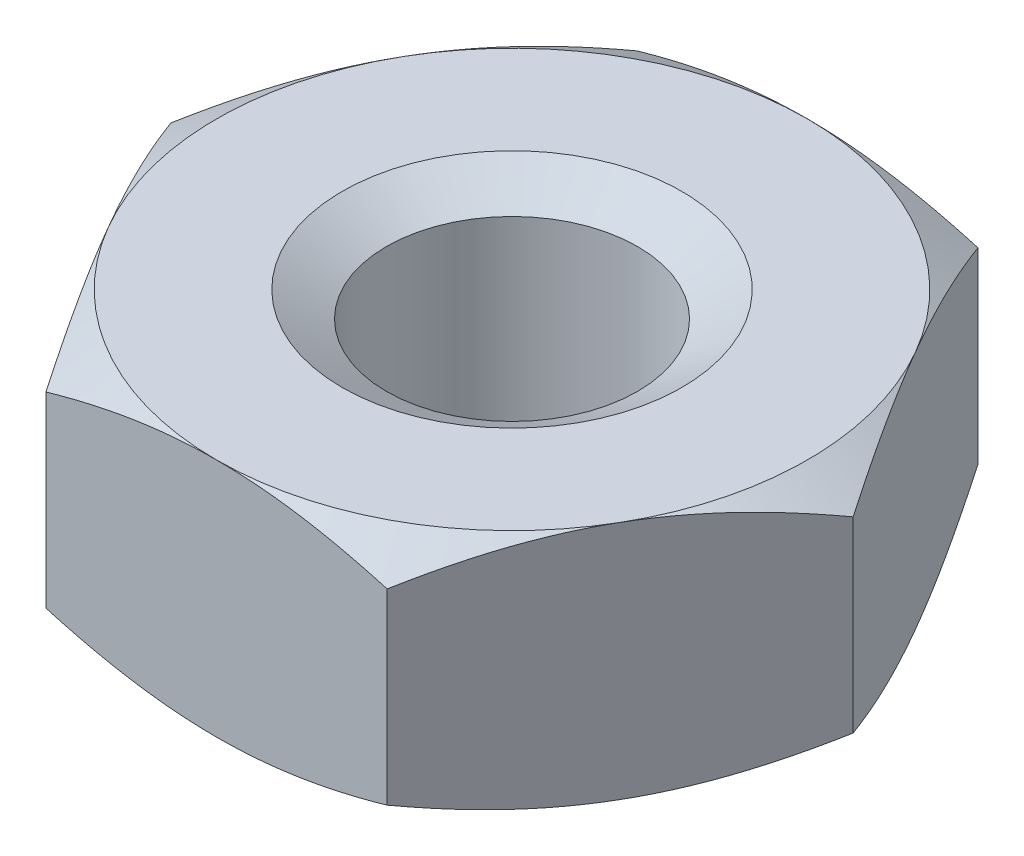
ISO-10303-21;
HEADER;
FILE_DESCRIPTION(('STEP AP214'),'2;1');
FILE_NAME('part.step','',(''),(''),'','','');
FILE_SCHEMA(('AUTOMOTIVE_DESIGN { 1 0 10303 214 1 1 1 1 }'));
ENDSEC;
DATA;
#1=APPLICATION_CONTEXT('core data for automotive mechanical design processes');
#2=APPLICATION_PROTOCOL_DEFINITION('international standard','automotive_design',2000,#1);
#3=PRODUCT_CONTEXT('',#1,'mechanical');
#4=PRODUCT('Part','Part','',(#3));
#5=PRODUCT_RELATED_PRODUCT_CATEGORY('part','',(#4));
#6=PRODUCT_DEFINITION_FORMATION('','',#4);
#7=PRODUCT_DEFINITION_CONTEXT('part definition',#1,'design');
#8=PRODUCT_DEFINITION('design','',#6,#7);
#9=PRODUCT_DEFINITION_SHAPE('','',#8);
#10=(LENGTH_UNIT() NAMED_UNIT(*) SI_UNIT(.MILLI.,.METRE.));
#11=(NAMED_UNIT(*) PLANE_ANGLE_UNIT() SI_UNIT($,.RADIAN.));
#12=(NAMED_UNIT(*) SI_UNIT($,.STERADIAN.) SOLID_ANGLE_UNIT());
#13=UNCERTAINTY_MEASURE_WITH_UNIT(LENGTH_MEASURE(1.E-05),#10,'distance_accuracy_value','');
#14=(GEOMETRIC_REPRESENTATION_CONTEXT(3) GLOBAL_UNCERTAINTY_ASSIGNED_CONTEXT((#13)) GLOBAL_UNIT_ASSIGNED_CONTEXT((#10,
#11,#12)) REPRESENTATION_CONTEXT('',''));
#15=CARTESIAN_POINT('',(0.,0.,0.));
#16=DIRECTION('',(0.,0.,1.));
#17=DIRECTION('',(1.,0.,0.));
#18=AXIS2_PLACEMENT_3D('',#15,#16,#17);
#19=CARTESIAN_POINT('',(1.84752086140681,-0.65,0.));
#20=DIRECTION('',(0.,1.,0.));
#21=DIRECTION('',(0.,0.,1.));
#22=AXIS2_PLACEMENT_3D('',#19,#20,#21);
#23=PLANE('',#22);
#24=CARTESIAN_POINT('',(0.,-0.650000000000017,0.));
#25=DIRECTION('',(0.,1.,0.));
#26=DIRECTION('',(0.,0.,1.));
#27=AXIS2_PLACEMENT_3D('',#24,#25,#26);
#28=CIRCLE('',#27,1.6);
#29=CARTESIAN_POINT('',(0.,-0.650000000000033,1.59999999999999));
#30=VERTEX_POINT('',#29);
#31=CARTESIAN_POINT('',(1.38564064605509,-0.650000000000025,0.800000000000011));
#32=VERTEX_POINT('',#31);
#33=EDGE_CURVE('E132',#30,#32,#28,.T.);
#34=ORIENTED_EDGE('',*,*,#33,.F.);
#35=CARTESIAN_POINT('',(0.,-0.65,0.));
#36=DIRECTION('',(0.,1.,0.));
#37=DIRECTION('',(0.,0.,1.));
#38=AXIS2_PLACEMENT_3D('',#35,#36,#37);
#39=CIRCLE('',#38,1.60000000000003);
#40=CARTESIAN_POINT('',(-1.38564064605509,-0.650000000000025,0.800000000000012));
#41=VERTEX_POINT('',#40);
#42=EDGE_CURVE('E11',#30,#41,#39,.F.);
#43=ORIENTED_EDGE('',*,*,#42,.T.);
#44=CARTESIAN_POINT('',(-1.38564064605511,-0.650000000000008,-0.799999999999981));
#45=VERTEX_POINT('',#44);
#46=EDGE_CURVE('E39',#41,#45,#39,.F.);
#47=ORIENTED_EDGE('',*,*,#46,.T.);
#48=CARTESIAN_POINT('',(0.,-0.65,-1.6));
#49=VERTEX_POINT('',#48);
#50=EDGE_CURVE('E346',#45,#49,#39,.F.);
#51=ORIENTED_EDGE('',*,*,#50,.T.);
#52=CARTESIAN_POINT('',(1.38564064605511,-0.650000000000008,-0.799999999999992));
#53=VERTEX_POINT('',#52);
#54=EDGE_CURVE('E142',#49,#53,#39,.F.);
#55=ORIENTED_EDGE('',*,*,#54,.T.);
#56=EDGE_CURVE('E41',#53,#32,#39,.F.);
#57=ORIENTED_EDGE('',*,*,#56,.T.);
#58=EDGE_LOOP('',(#34,#43,#47,#51,#55,#57));
#59=FACE_BOUND('',#58,.T.);
#60=CARTESIAN_POINT('',(0.,-0.65,0.));
#61=DIRECTION('',(0.,1.,0.));
#62=DIRECTION('',(0.,0.,1.));
#63=AXIS2_PLACEMENT_3D('',#60,#61,#62);
#64=CIRCLE('',#63,0.92);
#65=CARTESIAN_POINT('',(0.,-0.65,0.92));
#66=VERTEX_POINT('',#65);
#67=EDGE_CURVE('E255',#66,#66,#64,.T.);
#68=ORIENTED_EDGE('',*,*,#67,.T.);
#69=EDGE_LOOP('',(#68));
#70=FACE_BOUND('',#69,.T.);
#71=ADVANCED_FACE('F29',(#59,#70),#23,.F.);
#72=CARTESIAN_POINT('',(0.,-0.65,0.));
#73=DIRECTION('',(0.,1.,0.));
#74=DIRECTION('',(0.,0.,1.));
#75=AXIS2_PLACEMENT_3D('',#72,#73,#74);
#76=CYLINDRICAL_SURFACE('',#75,0.68);
#77=CARTESIAN_POINT('',(0.,0.511435935394491,0.));
#78=DIRECTION('',(0.,1.,0.));
#79=DIRECTION('',(0.,0.,1.));
#80=AXIS2_PLACEMENT_3D('',#77,#78,#79);
#81=CIRCLE('',#80,0.68);
#82=CARTESIAN_POINT('',(0.,0.511435935394491,0.68));
#83=VERTEX_POINT('',#82);
#84=EDGE_CURVE('E137',#83,#83,#81,.T.);
#85=ORIENTED_EDGE('',*,*,#84,.T.);
#86=EDGE_LOOP('',(#85));
#87=FACE_BOUND('',#86,.T.);
#88=CARTESIAN_POINT('',(0.,-0.511435935394491,0.));
#89=DIRECTION('',(0.,-1.,0.));
#90=DIRECTION('',(0.,0.,-1.));
#91=AXIS2_PLACEMENT_3D('',#88,#89,#90);
#92=CIRCLE('',#91,0.68);
#93=CARTESIAN_POINT('',(0.,-0.511435935394491,-0.68));
#94=VERTEX_POINT('',#93);
#95=EDGE_CURVE('E34',#94,#94,#92,.F.);
#96=ORIENTED_EDGE('',*,*,#95,.F.);
#97=EDGE_LOOP('',(#96));
#98=FACE_BOUND('',#97,.T.);
#99=ADVANCED_FACE('F169',(#87,#98),#76,.F.);
#100=CARTESIAN_POINT('',(0.923760430703417,0.65,1.59999999999999));
#101=DIRECTION('',(-0.866025403784439,0.,-0.499999999999999));
#102=DIRECTION('',(-0.499999999999999,0.,0.866025403784439));
#103=AXIS2_PLACEMENT_3D('',#100,#101,#102);
#104=PLANE('',#103);
#105=DIRECTION('',(0.,-1.,0.));
#106=VECTOR('',#105,1.);
#107=CARTESIAN_POINT('',(0.923760430703417,0.65,1.59999999999999));
#108=LINE('',#107,#106);
#109=CARTESIAN_POINT('',(0.923760430703417,0.507093764036709,1.59999999999999));
#110=VERTEX_POINT('',#109);
#111=CARTESIAN_POINT('',(0.923760430703417,-0.50709376403677,1.59999999999999));
#112=VERTEX_POINT('',#111);
#113=EDGE_CURVE('E147',#110,#112,#108,.T.);
#114=ORIENTED_EDGE('',*,*,#113,.T.);
#115=CARTESIAN_POINT('',(0.923644960649579,-0.507027091120494,1.60019999999999));
#116=CARTESIAN_POINT('',(0.964240585876116,-0.530476130648984,1.5298863145426));
#117=CARTESIAN_POINT('',(1.00518662765287,-0.551802641144221,1.45896568981643));
#118=CARTESIAN_POINT('',(1.08778782336024,-0.589029344135892,1.31589622208531));
#119=CARTESIAN_POINT('',(1.12944444565325,-0.604916365353103,1.24374483580212));
#120=CARTESIAN_POINT('',(1.21224140206854,-0.629648285435275,1.10033630057877));
#121=CARTESIAN_POINT('',(1.25336899245117,-0.638657763598411,1.02910122444318));
#122=CARTESIAN_POINT('',(1.33581782019458,-0.649415728756022,0.886295665767092));
#123=CARTESIAN_POINT('',(1.37713875761732,-0.651173121604833,0.814725702734531));
#124=CARTESIAN_POINT('',(1.45435771579557,-0.647528826941385,0.680978543862264));
#125=CARTESIAN_POINT('',(1.49026726082089,-0.643021940912404,0.618781387401727));
#126=CARTESIAN_POINT('',(1.5618523860239,-0.628734123806207,0.494792313483931));
#127=CARTESIAN_POINT('',(1.59752771836342,-0.618948305903803,0.433000825294993));
#128=CARTESIAN_POINT('',(1.66926059311825,-0.594483088670522,0.30875584164664));
#129=CARTESIAN_POINT('',(1.70530905059904,-0.579699920077157,0.24631808175543));
#130=CARTESIAN_POINT('',(1.77686812557048,-0.546147392216728,0.122374128162261));
#131=CARTESIAN_POINT('',(1.81237966076083,-0.527385923256054,0.0608663449578012));
#132=CARTESIAN_POINT('',(1.84763633146064,-0.507027091120478,-0.000199999999993177));
#133=B_SPLINE_CURVE_WITH_KNOTS('',3,(#115,#116,#117,#118,#119,#120,#121,#122,#123,#124,#125,
#126,#127,#128,#129,#130,#131,#132),.UNSPECIFIED.,.F.,.F.,(4,2,2,2,2,2,2,2,4),(0.,
0.253628622662479,0.507867113505241,0.75581244725919,1.00345320332839,1.21912891721901,
1.4350046304192,1.65567058644226,1.87590291418783),.UNSPECIFIED.);
#134=EDGE_CURVE('E53',#112,#32,#133,.T.);
#135=ORIENTED_EDGE('',*,*,#134,.T.);
#136=CARTESIAN_POINT('',(1.84752086140681,-0.507093764036754,0.));
#137=VERTEX_POINT('',#136);
#138=EDGE_CURVE('E121',#32,#137,#133,.T.);
#139=ORIENTED_EDGE('',*,*,#138,.T.);
#140=DIRECTION('',(0.,-1.,0.));
#141=VECTOR('',#140,1.);
#142=CARTESIAN_POINT('',(1.84752086140681,0.65,0.));
#143=LINE('',#142,#141);
#144=CARTESIAN_POINT('',(1.84752086140681,0.507093764036721,0.));
#145=VERTEX_POINT('',#144);
#146=EDGE_CURVE('E241',#145,#137,#143,.T.);
#147=ORIENTED_EDGE('',*,*,#146,.F.);
#148=CARTESIAN_POINT('',(1.84763633146064,0.507027091120445,-0.000199999999993179));
#149=CARTESIAN_POINT('',(1.80704070623411,0.530476130648936,0.070113685457395));
#150=CARTESIAN_POINT('',(1.76609466445735,0.551802641144175,0.141034310183567));
#151=CARTESIAN_POINT('',(1.68349346874998,0.589029344135848,0.284103777914686));
#152=CARTESIAN_POINT('',(1.64183684645697,0.604916365353061,0.356255164197875));
#153=CARTESIAN_POINT('',(1.55903989004168,0.629648285435234,0.499663699421233));
#154=CARTESIAN_POINT('',(1.51791229965905,0.638657763598371,0.570898775556817));
#155=CARTESIAN_POINT('',(1.43546347191564,0.649415728755983,0.713704334232908));
#156=CARTESIAN_POINT('',(1.3941425344929,0.651173121604794,0.78527429726547));
#157=CARTESIAN_POINT('',(1.31692357631465,0.647528826941346,0.919021456137737));
#158=CARTESIAN_POINT('',(1.28101403128933,0.643021940912366,0.981218612598273));
#159=CARTESIAN_POINT('',(1.20942890608632,0.628734123806167,1.10520768651607));
#160=CARTESIAN_POINT('',(1.1737535737468,0.618948305903763,1.16699917470501));
#161=CARTESIAN_POINT('',(1.10202069899197,0.594483088670481,1.29124415835336));
#162=CARTESIAN_POINT('',(1.06597224151118,0.579699920077116,1.35368191824457));
#163=CARTESIAN_POINT('',(0.994413166539739,0.546147392216685,1.47762587183774));
#164=CARTESIAN_POINT('',(0.958901631349387,0.52738592325601,1.5391336550422));
#165=CARTESIAN_POINT('',(0.923644960649579,0.507027091120433,1.60019999999999));
#166=B_SPLINE_CURVE_WITH_KNOTS('',3,(#148,#149,#150,#151,#152,#153,#154,#155,#156,#157,#158,
#159,#160,#161,#162,#163,#164,#165),.UNSPECIFIED.,.F.,.F.,(4,2,2,2,2,2,2,2,4),(0.,
0.253628622662481,0.507867113505245,0.755812447259196,1.0034532033284,1.21912891721901,
1.4350046304192,1.65567058644227,1.87590291418783),.UNSPECIFIED.);
#167=CARTESIAN_POINT('',(1.38564064605511,0.649999999999975,0.800000000000022));
#168=VERTEX_POINT('',#167);
#169=EDGE_CURVE('E304',#145,#168,#166,.T.);
#170=ORIENTED_EDGE('',*,*,#169,.T.);
#171=EDGE_CURVE('E299',#168,#110,#166,.T.);
#172=ORIENTED_EDGE('',*,*,#171,.T.);
#173=EDGE_LOOP('',(#114,#135,#139,#147,#170,#172));
#174=FACE_BOUND('',#173,.T.);
#175=ADVANCED_FACE('F31',(#174),#104,.F.);
#176=CARTESIAN_POINT('',(1.84752086140681,0.65,0.));
#177=DIRECTION('',(-0.866025403784436,0.,0.500000000000005));
#178=DIRECTION('',(0.500000000000005,0.,0.866025403784436));
#179=AXIS2_PLACEMENT_3D('',#176,#177,#178);
#180=PLANE('',#179);
#181=ORIENTED_EDGE('',*,*,#146,.T.);
#182=CARTESIAN_POINT('',(1.84763633146064,-0.507027091120477,0.000200000000006787));
#183=CARTESIAN_POINT('',(1.80704070623411,-0.530476130648968,-0.0701136854573808));
#184=CARTESIAN_POINT('',(1.76609466445735,-0.551802641144206,-0.141034310183552));
#185=CARTESIAN_POINT('',(1.68349346874998,-0.589029344135879,-0.284103777914669));
#186=CARTESIAN_POINT('',(1.64183684645697,-0.604916365353092,-0.356255164197858));
#187=CARTESIAN_POINT('',(1.55903989004168,-0.629648285435266,-0.499663699421214));
#188=CARTESIAN_POINT('',(1.51791229965905,-0.638657763598402,-0.570898775556797));
#189=CARTESIAN_POINT('',(1.43546347191564,-0.649415728756015,-0.713704334232886));
#190=CARTESIAN_POINT('',(1.3941425344929,-0.651173121604828,-0.785274297265447));
#191=CARTESIAN_POINT('',(1.31692357631464,-0.647528826941381,-0.919021456137716));
#192=CARTESIAN_POINT('',(1.28101403128932,-0.643021940912401,-0.981218612598256));
#193=CARTESIAN_POINT('',(1.2094289060863,-0.628734123806204,-1.10520768651606));
#194=CARTESIAN_POINT('',(1.17375357374679,-0.6189483059038,-1.166999174705));
#195=CARTESIAN_POINT('',(1.10202069899195,-0.594483088670518,-1.29124415835336));
#196=CARTESIAN_POINT('',(1.06597224151116,-0.579699920077152,-1.35368191824457));
#197=CARTESIAN_POINT('',(0.994413166539713,-0.546147392216721,-1.47762587183774));
#198=CARTESIAN_POINT('',(0.958901631349359,-0.527385923256046,-1.53913365504221));
#199=CARTESIAN_POINT('',(0.923644960649547,-0.507027091120468,-1.6002));
#200=B_SPLINE_CURVE_WITH_KNOTS('',3,(#182,#183,#184,#185,#186,#187,#188,#189,#190,#191,#192,
#193,#194,#195,#196,#197,#198,#199),.UNSPECIFIED.,.F.,.F.,(4,2,2,2,2,2,2,2,4),(0.,
0.253628622662479,0.507867113505241,0.75581244725919,1.00345320332839,1.21912891721902,
1.43500463041922,1.65567058644229,1.87590291418787),.UNSPECIFIED.);
#201=EDGE_CURVE('E126',#137,#53,#200,.T.);
#202=ORIENTED_EDGE('',*,*,#201,.T.);
#203=CARTESIAN_POINT('',(0.923760430703385,-0.507093764036744,-1.6));
#204=VERTEX_POINT('',#203);
#205=EDGE_CURVE('E157',#53,#204,#200,.T.);
#206=ORIENTED_EDGE('',*,*,#205,.T.);
#207=DIRECTION('',(0.,-1.,0.));
#208=VECTOR('',#207,1.);
#209=CARTESIAN_POINT('',(0.923760430703385,0.65,-1.6));
#210=LINE('',#209,#208);
#211=CARTESIAN_POINT('',(0.923760430703385,0.507093764036739,-1.6));
#212=VERTEX_POINT('',#211);
#213=EDGE_CURVE('E238',#212,#204,#210,.T.);
#214=ORIENTED_EDGE('',*,*,#213,.F.);
#215=CARTESIAN_POINT('',(0.923644960649548,0.507027091120463,-1.6002));
#216=CARTESIAN_POINT('',(0.964240585876086,0.530476130648954,-1.52988631454262));
#217=CARTESIAN_POINT('',(1.00518662765284,0.551802641144193,-1.45896568981644));
#218=CARTESIAN_POINT('',(1.08778782336022,0.589029344135867,-1.31589622208533));
#219=CARTESIAN_POINT('',(1.12944444565322,0.60491636535308,-1.24374483580214));
#220=CARTESIAN_POINT('',(1.21224140206852,0.629648285435254,-1.10033630057878));
#221=CARTESIAN_POINT('',(1.25336899245114,0.638657763598391,-1.0291012244432));
#222=CARTESIAN_POINT('',(1.33581782019456,0.649415728756003,-0.886295665767107));
#223=CARTESIAN_POINT('',(1.3771387576173,0.651173121604815,-0.814725702734546));
#224=CARTESIAN_POINT('',(1.45435771579555,0.647528826941367,-0.680978543862277));
#225=CARTESIAN_POINT('',(1.49026726082087,0.643021940912387,-0.618781387401737));
#226=CARTESIAN_POINT('',(1.56185238602389,0.628734123806188,-0.494792313483937));
#227=CARTESIAN_POINT('',(1.5975277183634,0.618948305903783,-0.433000825294996));
#228=CARTESIAN_POINT('',(1.66926059311824,0.5944830886705,-0.308755841646639));
#229=CARTESIAN_POINT('',(1.70530905059903,0.579699920077133,-0.246318081755426));
#230=CARTESIAN_POINT('',(1.77686812557048,0.5461473922167,-0.122374128162252));
#231=CARTESIAN_POINT('',(1.81237966076083,0.527385923256024,-0.0608663449577898));
#232=CARTESIAN_POINT('',(1.84763633146064,0.507027091120445,0.000200000000006741));
#233=B_SPLINE_CURVE_WITH_KNOTS('',3,(#215,#216,#217,#218,#219,#220,#221,#222,#223,#224,#225,
#226,#227,#228,#229,#230,#231,#232),.UNSPECIFIED.,.F.,.F.,(4,2,2,2,2,2,2,2,4),(0.,
0.253628622662481,0.507867113505244,0.755812447259194,1.0034532033284,1.21912891721902,
1.43500463041922,1.6556705864423,1.87590291418787),.UNSPECIFIED.);
#234=CARTESIAN_POINT('',(1.38564064605511,0.649999999999991,-0.799999999999995));
#235=VERTEX_POINT('',#234);
#236=EDGE_CURVE('E314',#212,#235,#233,.T.);
#237=ORIENTED_EDGE('',*,*,#236,.T.);
#238=EDGE_CURVE('E223',#235,#145,#233,.T.);
#239=ORIENTED_EDGE('',*,*,#238,.T.);
#240=EDGE_LOOP('',(#181,#202,#206,#214,#237,#239));
#241=FACE_BOUND('',#240,.T.);
#242=ADVANCED_FACE('F208',(#241),#180,.F.);
#243=CARTESIAN_POINT('',(0.923760430703385,0.65,-1.6));
#244=DIRECTION('',(0.,0.,1.));
#245=DIRECTION('',(1.,0.,0.));
#246=AXIS2_PLACEMENT_3D('',#243,#244,#245);
#247=PLANE('',#246);
#248=ORIENTED_EDGE('',*,*,#213,.T.);
#249=CARTESIAN_POINT('',(-2.5209846471538,0.150126997097003,-1.6));
#250=CARTESIAN_POINT('',(-2.45076148068393,0.115904931717625,-1.6));
#251=CARTESIAN_POINT('',(-2.38038131225264,0.081999718330343,-1.6));
#252=CARTESIAN_POINT('',(-2.23922362863108,0.0150004327425696,-1.6));
#253=CARTESIAN_POINT('',(-2.16844605632522,-0.0180935189937226,-1.6));
#254=CARTESIAN_POINT('',(-2.0260641790118,-0.0834509737892938,-1.6));
#255=CARTESIAN_POINT('',(-1.95445749211139,-0.11570930512278,-1.6));
#256=CARTESIAN_POINT('',(-1.81068831039181,-0.178957843825118,-1.6));
#257=CARTESIAN_POINT('',(-1.7385258408879,-0.209948108551772,-1.6));
#258=CARTESIAN_POINT('',(-1.59104276125482,-0.27136295948913,-1.6));
#259=CARTESIAN_POINT('',(-1.51569874994579,-0.301731646229661,-1.6));
#260=CARTESIAN_POINT('',(-1.36415873924484,-0.360259147099093,-1.6));
#261=CARTESIAN_POINT('',(-1.28796281408451,-0.388418152080569,-1.6));
#262=CARTESIAN_POINT('',(-1.13470603922019,-0.441825257862485,-1.6));
#263=CARTESIAN_POINT('',(-1.05764705228117,-0.467078652047236,-1.6));
#264=CARTESIAN_POINT('',(-0.90242428913327,-0.513887366477864,-1.6));
#265=CARTESIAN_POINT('',(-0.824260856491372,-0.535443810489637,-1.6));
#266=CARTESIAN_POINT('',(-0.667228536874516,-0.573732922571515,-1.6));
#267=CARTESIAN_POINT('',(-0.588366526526667,-0.590493282507139,-1.6));
#268=CARTESIAN_POINT('',(-0.429622055404563,-0.618273619251159,-1.6));
#269=CARTESIAN_POINT('',(-0.349739703219398,-0.629294201781119,-1.6));
#270=CARTESIAN_POINT('',(-0.190409371418089,-0.644570738337796,-1.6));
#271=CARTESIAN_POINT('',(-0.110970273306694,-0.648916704735154,-1.6));
#272=CARTESIAN_POINT('',(0.0479847198414701,-0.650725446740208,-1.6));
#273=CARTESIAN_POINT('',(0.127500615320099,-0.648188182505916,-1.6));
#274=CARTESIAN_POINT('',(0.315948267624273,-0.634233456236218,-1.6));
#275=CARTESIAN_POINT('',(0.424660647824706,-0.619827036410199,-1.6));
#276=CARTESIAN_POINT('',(0.640184372550368,-0.580568185670082,-1.6));
#277=CARTESIAN_POINT('',(0.746993876383825,-0.555706157984184,-1.6));
#278=CARTESIAN_POINT('',(0.960879709209229,-0.497630124804474,-1.6));
#279=CARTESIAN_POINT('',(1.06790639530111,-0.464238301106111,-1.6));
#280=CARTESIAN_POINT('',(1.27996601991254,-0.391812517385375,-1.6));
#281=CARTESIAN_POINT('',(1.38499941444163,-0.352779865868096,-1.6));
#282=CARTESIAN_POINT('',(1.56799469532871,-0.280792189051455,-1.6));
#283=CARTESIAN_POINT('',(1.64629502070004,-0.248685434535845,-1.6));
#284=CARTESIAN_POINT('',(1.80215714392472,-0.182721638624275,-1.6));
#285=CARTESIAN_POINT('',(1.87971890500665,-0.14886451061522,-1.6));
#286=CARTESIAN_POINT('',(2.11154275742073,-0.045256837842374,-1.6));
#287=CARTESIAN_POINT('',(2.26490000358049,0.0265123792197082,-1.6));
#288=CARTESIAN_POINT('',(2.57016984682327,0.173498218896941,-1.6));
#289=CARTESIAN_POINT('',(2.72208039110132,0.248719051804576,-1.6));
#290=CARTESIAN_POINT('',(3.0247737416671,0.401405516169311,-1.6));
#291=CARTESIAN_POINT('',(3.17555650255188,0.478871237396957,-1.6));
#292=CARTESIAN_POINT('',(3.46221292814765,0.628015105044151,-1.6));
#293=CARTESIAN_POINT('',(3.59815887438349,0.699554850107216,-1.6));
#294=CARTESIAN_POINT('',(3.86955633050092,0.843580617163559,-1.6));
#295=CARTESIAN_POINT('',(4.00500781663135,0.916066683867109,-1.6));
#296=CARTESIAN_POINT('',(4.27512524652783,1.06153370741179,-1.6));
#297=CARTESIAN_POINT('',(4.40979232852615,1.1345125538553,-1.6));
#298=CARTESIAN_POINT('',(4.67881425363029,1.28102238761861,-1.6));
#299=CARTESIAN_POINT('',(4.8131691170335,1.35455333765194,-1.6));
#300=CARTESIAN_POINT('',(4.94741144427291,1.42828775894541,-1.6));
#301=B_SPLINE_CURVE_WITH_KNOTS('',3,(#249,#250,#251,#252,#253,#254,#255,#256,#257,#258,#259,
#260,#261,#262,#263,#264,#265,#266,#267,#268,#269,#270,#271,#272,#273,#274,#275,#276,#277,#278,
#279,#280,#281,#282,#283,#284,#285,#286,#287,#288,#289,#290,#291,#292,#293,#294,#295,#296,#297,
#298,#299,#300),.UNSPECIFIED.,.F.,.F.,(4,2,2,2,2,2,2,2,2,2,2,2,2,2,2,2,2,2,2,2,2,2,2,2,2,4),(0.,
0.234357079428913,0.468748750279352,0.704350974848533,0.939942530736662,1.18361811156503,
1.42727262265482,1.67047597479612,1.9136052686188,2.15530105907556,2.39697133808456,
2.63535296525648,2.8737359722482,3.20204898339032,3.53066399949839,3.86678588935125,
4.20282993365774,4.45668877352339,4.71056018703942,5.21844347803248,5.72696367086358,
6.23550422697985,6.69636122455273,7.15724007532143,7.61674952754049,8.07622822089323),.UNSPECIFIED.);
#302=EDGE_CURVE('E202',#204,#49,#301,.F.);
#303=ORIENTED_EDGE('',*,*,#302,.T.);
#304=CARTESIAN_POINT('',(-0.923760430703413,-0.507093764036735,-1.6));
#305=VERTEX_POINT('',#304);
#306=EDGE_CURVE('E196',#49,#305,#301,.F.);
#307=ORIENTED_EDGE('',*,*,#306,.T.);
#308=DIRECTION('',(0.,-1.,0.));
#309=VECTOR('',#308,1.);
#310=CARTESIAN_POINT('',(-0.923760430703413,0.65,-1.6));
#311=LINE('',#310,#309);
#312=CARTESIAN_POINT('',(-0.923760430703413,0.507093764036731,-1.6));
#313=VERTEX_POINT('',#312);
#314=EDGE_CURVE('E235',#313,#305,#311,.T.);
#315=ORIENTED_EDGE('',*,*,#314,.F.);
#316=CARTESIAN_POINT('',(-2.52098464715381,-0.150126997097039,-1.6));
#317=CARTESIAN_POINT('',(-2.45076148068394,-0.11590493171766,-1.6));
#318=CARTESIAN_POINT('',(-2.38038131225265,-0.0819997183303765,-1.6));
#319=CARTESIAN_POINT('',(-2.2392236286311,-0.0150004327425998,-1.6));
#320=CARTESIAN_POINT('',(-2.16844605632523,0.0180935189936941,-1.6));
#321=CARTESIAN_POINT('',(-2.02606417901181,0.0834509737892686,-1.6));
#322=CARTESIAN_POINT('',(-1.95445749211141,0.115709305122757,-1.6));
#323=CARTESIAN_POINT('',(-1.81068831039182,0.178957843825098,-1.6));
#324=CARTESIAN_POINT('',(-1.7385258408879,0.209948108551753,-1.6));
#325=CARTESIAN_POINT('',(-1.59104276125483,0.271362959489114,-1.6));
#326=CARTESIAN_POINT('',(-1.5156987499458,0.301731646229646,-1.6));
#327=CARTESIAN_POINT('',(-1.36415873924484,0.360259147099081,-1.6));
#328=CARTESIAN_POINT('',(-1.28796281408452,0.388418152080558,-1.6));
#329=CARTESIAN_POINT('',(-1.1347060392202,0.441825257862477,-1.6));
#330=CARTESIAN_POINT('',(-1.05764705228118,0.467078652047228,-1.6));
#331=CARTESIAN_POINT('',(-0.902424289133273,0.51388736647786,-1.6));
#332=CARTESIAN_POINT('',(-0.824260856491374,0.535443810489633,-1.6));
#333=CARTESIAN_POINT('',(-0.667228536874516,0.573732922571512,-1.6));
#334=CARTESIAN_POINT('',(-0.588366526526665,0.590493282507137,-1.6));
#335=CARTESIAN_POINT('',(-0.42962205540456,0.618273619251159,-1.6));
#336=CARTESIAN_POINT('',(-0.349739703219394,0.629294201781119,-1.6));
#337=CARTESIAN_POINT('',(-0.190409371418084,0.644570738337796,-1.6));
#338=CARTESIAN_POINT('',(-0.110970273306687,0.648916704735155,-1.6));
#339=CARTESIAN_POINT('',(0.0479847198414789,0.650725446740208,-1.6));
#340=CARTESIAN_POINT('',(0.127500615320109,0.648188182505916,-1.6));
#341=CARTESIAN_POINT('',(0.31594826762428,0.634233456236217,-1.6));
#342=CARTESIAN_POINT('',(0.424660647824708,0.619827036410197,-1.6));
#343=CARTESIAN_POINT('',(0.640184372550362,0.580568185670081,-1.6));
#344=CARTESIAN_POINT('',(0.746993876383816,0.555706157984184,-1.6));
#345=CARTESIAN_POINT('',(0.960879709209211,0.497630124804475,-1.6));
#346=CARTESIAN_POINT('',(1.06790639530109,0.464238301106112,-1.6));
#347=CARTESIAN_POINT('',(1.27996601991251,0.391812517385378,-1.6));
#348=CARTESIAN_POINT('',(1.3849994144416,0.352779865868099,-1.6));
#349=CARTESIAN_POINT('',(1.56799469532867,0.280792189051458,-1.6));
#350=CARTESIAN_POINT('',(1.6462950207,0.248685434535847,-1.6));
#351=CARTESIAN_POINT('',(1.80215714392468,0.182721638624275,-1.6));
#352=CARTESIAN_POINT('',(1.87971890500661,0.148864510615219,-1.6));
#353=CARTESIAN_POINT('',(2.11154275742069,0.0452568378423704,-1.6));
#354=CARTESIAN_POINT('',(2.26490000358045,-0.0265123792197144,-1.6));
#355=CARTESIAN_POINT('',(2.57016984682323,-0.173498218896952,-1.6));
#356=CARTESIAN_POINT('',(2.72208039110128,-0.24871905180459,-1.6));
#357=CARTESIAN_POINT('',(3.02477374166706,-0.40140551616933,-1.6));
#358=CARTESIAN_POINT('',(3.17555650255183,-0.478871237396978,-1.6));
#359=CARTESIAN_POINT('',(3.4622129281476,-0.628015105044177,-1.6));
#360=CARTESIAN_POINT('',(3.59815887438344,-0.699554850107245,-1.6));
#361=CARTESIAN_POINT('',(3.86955633050087,-0.843580617163592,-1.6));
#362=CARTESIAN_POINT('',(4.0050078166313,-0.916066683867144,-1.6));
#363=CARTESIAN_POINT('',(4.27512524652777,-1.06153370741183,-1.6));
#364=CARTESIAN_POINT('',(4.40979232852609,-1.13451255385534,-1.6));
#365=CARTESIAN_POINT('',(4.67881425363023,-1.28102238761866,-1.6));
#366=CARTESIAN_POINT('',(4.81316911703343,-1.35455333765199,-1.6));
#367=CARTESIAN_POINT('',(4.94741144427284,-1.42828775894547,-1.6));
#368=B_SPLINE_CURVE_WITH_KNOTS('',3,(#316,#317,#318,#319,#320,#321,#322,#323,#324,#325,#326,
#327,#328,#329,#330,#331,#332,#333,#334,#335,#336,#337,#338,#339,#340,#341,#342,#343,#344,#345,
#346,#347,#348,#349,#350,#351,#352,#353,#354,#355,#356,#357,#358,#359,#360,#361,#362,#363,#364,
#365,#366,#367),.UNSPECIFIED.,.F.,.F.,(4,2,2,2,2,2,2,2,2,2,2,2,2,2,2,2,2,2,2,2,2,2,2,2,2,4),(0.,
0.234357079428916,0.468748750279358,0.704350974848542,0.939942530736673,1.18361811156505,
1.42727262265484,1.67047597479614,1.91360526861883,2.15530105907558,2.39697133808459,
2.63535296525651,2.87373597224824,3.20204898339035,3.53066399949841,3.86678588935125,
4.20282993365773,4.45668877352338,4.71056018703941,5.21844347803247,5.72696367086357,
6.23550422697985,6.69636122455272,7.15724007532142,7.61674952754048,8.07622822089323),.UNSPECIFIED.);
#369=CARTESIAN_POINT('',(0.,0.65,-1.6));
#370=VERTEX_POINT('',#369);
#371=EDGE_CURVE('E221',#313,#370,#368,.T.);
#372=ORIENTED_EDGE('',*,*,#371,.T.);
#373=EDGE_CURVE('E214',#370,#212,#368,.T.);
#374=ORIENTED_EDGE('',*,*,#373,.T.);
#375=EDGE_LOOP('',(#248,#303,#307,#315,#372,#374));
#376=FACE_BOUND('',#375,.T.);
#377=ADVANCED_FACE('F204',(#376),#247,.F.);
#378=CARTESIAN_POINT('',(-0.923760430703413,0.65,-1.6));
#379=DIRECTION('',(0.86602540378444,0.,0.499999999999998));
#380=DIRECTION('',(0.499999999999998,0.,-0.86602540378444));
#381=AXIS2_PLACEMENT_3D('',#378,#379,#380);
#382=PLANE('',#381);
#383=ORIENTED_EDGE('',*,*,#314,.T.);
#384=CARTESIAN_POINT('',(-0.923644960649575,-0.50702709112046,-1.6002));
#385=CARTESIAN_POINT('',(-0.964240585876112,-0.530476130648951,-1.52988631454262));
#386=CARTESIAN_POINT('',(-1.00518662765286,-0.55180264114419,-1.45896568981645));
#387=CARTESIAN_POINT('',(-1.08778782336024,-0.589029344135864,-1.31589622208533));
#388=CARTESIAN_POINT('',(-1.12944444565324,-0.604916365353078,-1.24374483580214));
#389=CARTESIAN_POINT('',(-1.21224140206854,-0.629648285435253,-1.10033630057878));
#390=CARTESIAN_POINT('',(-1.25336899245116,-0.638657763598391,-1.0291012244432));
#391=CARTESIAN_POINT('',(-1.33581782019458,-0.649415728756005,-0.886295665767108));
#392=CARTESIAN_POINT('',(-1.37713875761732,-0.651173121604818,-0.814725702734546));
#393=CARTESIAN_POINT('',(-1.45435771579557,-0.647528826941373,-0.680978543862278));
#394=CARTESIAN_POINT('',(-1.49026726082089,-0.643021940912394,-0.618781387401739));
#395=CARTESIAN_POINT('',(-1.5618523860239,-0.628734123806198,-0.49479231348394));
#396=CARTESIAN_POINT('',(-1.59752771836342,-0.618948305903795,-0.433000825294999));
#397=CARTESIAN_POINT('',(-1.66926059311825,-0.594483088670516,-0.308755841646643));
#398=CARTESIAN_POINT('',(-1.70530905059904,-0.579699920077152,-0.246318081755431));
#399=CARTESIAN_POINT('',(-1.77686812557049,-0.546147392216723,-0.122374128162257));
#400=CARTESIAN_POINT('',(-1.81237966076084,-0.52738592325605,-0.0608663449577955));
#401=CARTESIAN_POINT('',(-1.84763633146065,-0.507027091120474,0.000200000000000618));
#402=B_SPLINE_CURVE_WITH_KNOTS('',3,(#384,#385,#386,#387,#388,#389,#390,#391,#392,#393,#394,
#395,#396,#397,#398,#399,#400,#401),.UNSPECIFIED.,.F.,.F.,(4,2,2,2,2,2,2,2,4),(0.,
0.253628622662479,0.507867113505242,0.755812447259191,1.00345320332839,1.21912891721902,
1.43500463041921,1.65567058644228,1.87590291418785),.UNSPECIFIED.);
#403=EDGE_CURVE('E203',#305,#45,#402,.T.);
#404=ORIENTED_EDGE('',*,*,#403,.T.);
#405=CARTESIAN_POINT('',(-1.84752086140681,-0.50709376403675,0.));
#406=VERTEX_POINT('',#405);
#407=EDGE_CURVE('E191',#45,#406,#402,.T.);
#408=ORIENTED_EDGE('',*,*,#407,.T.);
#409=DIRECTION('',(0.,-1.,0.));
#410=VECTOR('',#409,1.);
#411=CARTESIAN_POINT('',(-1.84752086140681,0.65,0.));
#412=LINE('',#411,#410);
#413=CARTESIAN_POINT('',(-1.84752086140681,0.507093764036717,0.));
#414=VERTEX_POINT('',#413);
#415=EDGE_CURVE('E232',#414,#406,#412,.T.);
#416=ORIENTED_EDGE('',*,*,#415,.F.);
#417=CARTESIAN_POINT('',(-1.84763633146065,0.507027091120441,0.000200000000000537));
#418=CARTESIAN_POINT('',(-1.80704070623411,0.530476130648934,-0.0701136854573877));
#419=CARTESIAN_POINT('',(-1.76609466445736,0.551802641144174,-0.141034310183559));
#420=CARTESIAN_POINT('',(-1.68349346874998,0.589029344135849,-0.284103777914679));
#421=CARTESIAN_POINT('',(-1.64183684645698,0.604916365353063,-0.356255164197868));
#422=CARTESIAN_POINT('',(-1.55903989004168,0.62964828543524,-0.499663699421226));
#423=CARTESIAN_POINT('',(-1.51791229965906,0.638657763598378,-0.570898775556811));
#424=CARTESIAN_POINT('',(-1.43546347191565,0.649415728755992,-0.713704334232902));
#425=CARTESIAN_POINT('',(-1.3941425344929,0.651173121604805,-0.785274297265464));
#426=CARTESIAN_POINT('',(-1.31692357631465,0.647528826941359,-0.919021456137733));
#427=CARTESIAN_POINT('',(-1.28101403128933,0.64302194091238,-0.981218612598271));
#428=CARTESIAN_POINT('',(-1.20942890608632,0.628734123806184,-1.10520768651607));
#429=CARTESIAN_POINT('',(-1.17375357374681,0.61894830590378,-1.16699917470501));
#430=CARTESIAN_POINT('',(-1.10202069899197,0.5944830886705,-1.29124415835336));
#431=CARTESIAN_POINT('',(-1.06597224151118,0.579699920077136,-1.35368191824457));
#432=CARTESIAN_POINT('',(-0.994413166539738,0.546147392216706,-1.47762587183775));
#433=CARTESIAN_POINT('',(-0.958901631349385,0.527385923256032,-1.53913365504221));
#434=CARTESIAN_POINT('',(-0.923644960649575,0.507027091120455,-1.6002));
#435=B_SPLINE_CURVE_WITH_KNOTS('',3,(#417,#418,#419,#420,#421,#422,#423,#424,#425,#426,#427,
#428,#429,#430,#431,#432,#433,#434),.UNSPECIFIED.,.F.,.F.,(4,2,2,2,2,2,2,2,4),(0.,
0.253628622662482,0.507867113505247,0.755812447259199,1.0034532033284,1.21912891721902,
1.43500463041921,1.65567058644228,1.87590291418786),.UNSPECIFIED.);
#436=CARTESIAN_POINT('',(-1.38564064605512,0.649999999999991,-0.799999999999984));
#437=VERTEX_POINT('',#436);
#438=EDGE_CURVE('E305',#414,#437,#435,.T.);
#439=ORIENTED_EDGE('',*,*,#438,.T.);
#440=EDGE_CURVE('E222',#437,#313,#435,.T.);
#441=ORIENTED_EDGE('',*,*,#440,.T.);
#442=EDGE_LOOP('',(#383,#404,#408,#416,#439,#441));
#443=FACE_BOUND('',#442,.T.);
#444=ADVANCED_FACE('F207',(#443),#382,.F.);
#445=CARTESIAN_POINT('',(-1.84752086140681,0.65,0.));
#446=DIRECTION('',(0.866025403784439,0.,-0.499999999999999));
#447=DIRECTION('',(-0.499999999999999,0.,-0.866025403784439));
#448=AXIS2_PLACEMENT_3D('',#445,#446,#447);
#449=PLANE('',#448);
#450=ORIENTED_EDGE('',*,*,#415,.T.);
#451=CARTESIAN_POINT('',(-1.84763633146065,-0.507027091120473,-0.000199999999999429));
#452=CARTESIAN_POINT('',(-1.80704070623411,-0.530476130648965,0.0701136854573884));
#453=CARTESIAN_POINT('',(-1.76609466445736,-0.551802641144204,0.14103431018356));
#454=CARTESIAN_POINT('',(-1.68349346874998,-0.589029344135878,0.284103777914678));
#455=CARTESIAN_POINT('',(-1.64183684645698,-0.604916365353091,0.356255164197867));
#456=CARTESIAN_POINT('',(-1.55903989004169,-0.629648285435266,0.499663699421224));
#457=CARTESIAN_POINT('',(-1.51791229965906,-0.638657763598404,0.570898775556808));
#458=CARTESIAN_POINT('',(-1.43546347191565,-0.649415728756018,0.713704334232899));
#459=CARTESIAN_POINT('',(-1.39414253449291,-0.651173121604831,0.78527429726546));
#460=CARTESIAN_POINT('',(-1.31692357631466,-0.647528826941386,0.919021456137727));
#461=CARTESIAN_POINT('',(-1.28101403128934,-0.643021940912407,0.981218612598264));
#462=CARTESIAN_POINT('',(-1.20942890608632,-0.628734123806212,1.10520768651606));
#463=CARTESIAN_POINT('',(-1.17375357374681,-0.61894830590381,1.166999174705));
#464=CARTESIAN_POINT('',(-1.10202069899197,-0.594483088670531,1.29124415835335));
#465=CARTESIAN_POINT('',(-1.06597224151119,-0.579699920077168,1.35368191824456));
#466=CARTESIAN_POINT('',(-0.994413166539744,-0.546147392216741,1.47762587183774));
#467=CARTESIAN_POINT('',(-0.958901631349391,-0.527385923256068,1.5391336550422));
#468=CARTESIAN_POINT('',(-0.923644960649582,-0.507027091120493,1.60019999999999));
#469=B_SPLINE_CURVE_WITH_KNOTS('',3,(#451,#452,#453,#454,#455,#456,#457,#458,#459,#460,#461,
#462,#463,#464,#465,#466,#467,#468),.UNSPECIFIED.,.F.,.F.,(4,2,2,2,2,2,2,2,4),(0.,
0.25362862266248,0.507867113505242,0.755812447259193,1.00345320332839,1.21912891721901,
1.4350046304192,1.65567058644227,1.87590291418784),.UNSPECIFIED.);
#470=EDGE_CURVE('E354',#406,#41,#469,.T.);
#471=ORIENTED_EDGE('',*,*,#470,.T.);
#472=CARTESIAN_POINT('',(-0.923760430703491,-0.507093764036816,1.59999999999999));
#473=VERTEX_POINT('',#472);
#474=EDGE_CURVE('E184',#41,#473,#469,.T.);
#475=ORIENTED_EDGE('',*,*,#474,.T.);
#476=DIRECTION('',(0.,-1.,0.));
#477=VECTOR('',#476,1.);
#478=CARTESIAN_POINT('',(-0.92376043070342,0.65,1.59999999999999));
#479=LINE('',#478,#477);
#480=CARTESIAN_POINT('',(-0.92376043070342,0.507093764036708,1.59999999999999));
#481=VERTEX_POINT('',#480);
#482=EDGE_CURVE('E229',#481,#473,#479,.T.);
#483=ORIENTED_EDGE('',*,*,#482,.F.);
#484=CARTESIAN_POINT('',(-0.923644960649582,0.507027091120432,1.60019999999999));
#485=CARTESIAN_POINT('',(-0.964240585876119,0.530476130648924,1.5298863145426));
#486=CARTESIAN_POINT('',(-1.00518662765287,0.551802641144164,1.45896568981643));
#487=CARTESIAN_POINT('',(-1.08778782336025,0.589029344135839,1.31589622208531));
#488=CARTESIAN_POINT('',(-1.12944444565325,0.604916365353053,1.24374483580212));
#489=CARTESIAN_POINT('',(-1.21224140206855,0.629648285435229,1.10033630057877));
#490=CARTESIAN_POINT('',(-1.25336899245117,0.638657763598366,1.02910122444318));
#491=CARTESIAN_POINT('',(-1.33581782019458,0.64941572875598,0.886295665767093));
#492=CARTESIAN_POINT('',(-1.37713875761733,0.651173121604792,0.814725702734531));
#493=CARTESIAN_POINT('',(-1.45435771579558,0.647528826941346,0.680978543862264));
#494=CARTESIAN_POINT('',(-1.4902672608209,0.643021940912367,0.618781387401727));
#495=CARTESIAN_POINT('',(-1.56185238602391,0.62873412380617,0.49479231348393));
#496=CARTESIAN_POINT('',(-1.59752771836342,0.618948305903766,0.433000825294991));
#497=CARTESIAN_POINT('',(-1.66926059311826,0.594483088670486,0.308755841646637));
#498=CARTESIAN_POINT('',(-1.70530905059905,0.579699920077121,0.246318081755427));
#499=CARTESIAN_POINT('',(-1.77686812557049,0.546147392216692,0.122374128162256));
#500=CARTESIAN_POINT('',(-1.81237966076084,0.527385923256018,0.0608663449577958));
#501=CARTESIAN_POINT('',(-1.84763633146065,0.507027091120441,-0.000199999999999172));
#502=B_SPLINE_CURVE_WITH_KNOTS('',3,(#484,#485,#486,#487,#488,#489,#490,#491,#492,#493,#494,
#495,#496,#497,#498,#499,#500,#501),.UNSPECIFIED.,.F.,.F.,(4,2,2,2,2,2,2,2,4),(0.,
0.25362862266248,0.507867113505243,0.755812447259193,1.00345320332839,1.21912891721901,
1.4350046304192,1.65567058644227,1.87590291418784),.UNSPECIFIED.);
#503=CARTESIAN_POINT('',(-1.38564064605511,0.649999999999975,0.800000000000022));
#504=VERTEX_POINT('',#503);
#505=EDGE_CURVE('E293',#481,#504,#502,.T.);
#506=ORIENTED_EDGE('',*,*,#505,.T.);
#507=EDGE_CURVE('E300',#504,#414,#502,.T.);
#508=ORIENTED_EDGE('',*,*,#507,.T.);
#509=EDGE_LOOP('',(#450,#471,#475,#483,#506,#508));
#510=FACE_BOUND('',#509,.T.);
#511=ADVANCED_FACE('F283',(#510),#449,.F.);
#512=CARTESIAN_POINT('',(-0.92376043070342,0.65,1.59999999999999));
#513=DIRECTION('',(0.,0.,-1.));
#514=DIRECTION('',(-1.,0.,0.));
#515=AXIS2_PLACEMENT_3D('',#512,#513,#514);
#516=PLANE('',#515);
#517=ORIENTED_EDGE('',*,*,#482,.T.);
#518=CARTESIAN_POINT('',(-2.52098464715381,0.150126997096969,1.59999999999999));
#519=CARTESIAN_POINT('',(-2.45076148068394,0.115904931717591,1.59999999999999));
#520=CARTESIAN_POINT('',(-2.38038131225265,0.0819997183303093,1.59999999999999));
#521=CARTESIAN_POINT('',(-2.2392236286311,0.015000432742536,1.59999999999999));
#522=CARTESIAN_POINT('',(-2.16844605632523,-0.0180935189937563,1.59999999999999));
#523=CARTESIAN_POINT('',(-2.02606417901181,-0.0834509737893274,1.59999999999999));
#524=CARTESIAN_POINT('',(-1.9544574921114,-0.115709305122814,1.59999999999999));
#525=CARTESIAN_POINT('',(-1.81068831039182,-0.178957843825152,1.59999999999999));
#526=CARTESIAN_POINT('',(-1.73852584088791,-0.209948108551806,1.59999999999999));
#527=CARTESIAN_POINT('',(-1.59104276125483,-0.271362959489163,1.59999999999999));
#528=CARTESIAN_POINT('',(-1.5156987499458,-0.301731646229694,1.59999999999999));
#529=CARTESIAN_POINT('',(-1.36415873924485,-0.360259147099126,1.59999999999999));
#530=CARTESIAN_POINT('',(-1.28796281408452,-0.388418152080602,1.59999999999999));
#531=CARTESIAN_POINT('',(-1.1347060392202,-0.441825257862518,1.59999999999999));
#532=CARTESIAN_POINT('',(-1.05764705228118,-0.467078652047268,1.59999999999999));
#533=CARTESIAN_POINT('',(-0.902424289133279,-0.513887366477897,1.59999999999999));
#534=CARTESIAN_POINT('',(-0.824260856491382,-0.53544381048967,1.59999999999999));
#535=CARTESIAN_POINT('',(-0.667228536874525,-0.573732922571547,1.59999999999999));
#536=CARTESIAN_POINT('',(-0.588366526526676,-0.590493282507171,1.59999999999999));
#537=CARTESIAN_POINT('',(-0.429622055404572,-0.618273619251192,1.59999999999999));
#538=CARTESIAN_POINT('',(-0.349739703219407,-0.629294201781152,1.59999999999999));
#539=CARTESIAN_POINT('',(-0.190409371418099,-0.644570738337829,1.59999999999999));
#540=CARTESIAN_POINT('',(-0.110970273306703,-0.648916704735188,1.59999999999999));
#541=CARTESIAN_POINT('',(0.0479847198414608,-0.650725446740242,1.59999999999999));
#542=CARTESIAN_POINT('',(0.12750061532009,-0.648188182505951,1.59999999999999));
#543=CARTESIAN_POINT('',(0.315948267624264,-0.634233456236253,1.59999999999999));
#544=CARTESIAN_POINT('',(0.424660647824697,-0.619827036410234,1.59999999999999));
#545=CARTESIAN_POINT('',(0.64018437255036,-0.580568185670119,1.59999999999999));
#546=CARTESIAN_POINT('',(0.746993876383818,-0.555706157984221,1.59999999999999));
#547=CARTESIAN_POINT('',(0.960879709209223,-0.497630124804511,1.59999999999999));
#548=CARTESIAN_POINT('',(1.0679063953011,-0.464238301106149,1.59999999999999));
#549=CARTESIAN_POINT('',(1.27996601991254,-0.391812517385413,1.59999999999999));
#550=CARTESIAN_POINT('',(1.38499941444163,-0.352779865868133,1.59999999999999));
#551=CARTESIAN_POINT('',(1.5679946953287,-0.280792189051492,1.59999999999999));
#552=CARTESIAN_POINT('',(1.64629502070003,-0.248685434535882,1.59999999999999));
#553=CARTESIAN_POINT('',(1.80215714392472,-0.182721638624312,1.59999999999999));
#554=CARTESIAN_POINT('',(1.87971890500665,-0.148864510615256,1.59999999999999));
#555=CARTESIAN_POINT('',(2.11154275742074,-0.0452568378424088,1.59999999999999));
#556=CARTESIAN_POINT('',(2.2649000035805,0.0265123792196745,1.59999999999999));
#557=CARTESIAN_POINT('',(2.57016984682329,0.17349821889691,1.59999999999999));
#558=CARTESIAN_POINT('',(2.72208039110134,0.248719051804546,1.59999999999999));
#559=CARTESIAN_POINT('',(3.02477374166713,0.401405516169284,1.59999999999999));
#560=CARTESIAN_POINT('',(3.1755565025519,0.478871237396931,1.59999999999999));
#561=CARTESIAN_POINT('',(3.46221292814768,0.628015105044127,1.59999999999999));
#562=CARTESIAN_POINT('',(3.59815887438352,0.699554850107193,1.59999999999999));
#563=CARTESIAN_POINT('',(3.86955633050096,0.843580617163538,1.59999999999999));
#564=CARTESIAN_POINT('',(4.00500781663139,0.916066683867089,1.59999999999999));
#565=CARTESIAN_POINT('',(4.27512524652787,1.06153370741177,1.59999999999999));
#566=CARTESIAN_POINT('',(4.40979232852619,1.13451255385528,1.59999999999999));
#567=CARTESIAN_POINT('',(4.67881425363034,1.28102238761859,1.59999999999999));
#568=CARTESIAN_POINT('',(4.81316911703355,1.35455333765193,1.59999999999999));
#569=CARTESIAN_POINT('',(4.94741144427296,1.4282877589454,1.59999999999999));
#570=B_SPLINE_CURVE_WITH_KNOTS('',3,(#518,#519,#520,#521,#522,#523,#524,#525,#526,#527,#528,
#529,#530,#531,#532,#533,#534,#535,#536,#537,#538,#539,#540,#541,#542,#543,#544,#545,#546,#547,
#548,#549,#550,#551,#552,#553,#554,#555,#556,#557,#558,#559,#560,#561,#562,#563,#564,#565,#566,
#567,#568,#569),.UNSPECIFIED.,.F.,.F.,(4,2,2,2,2,2,2,2,2,2,2,2,2,2,2,2,2,2,2,2,2,2,2,2,2,4),(0.,
0.234357079428913,0.468748750279353,0.704350974848534,0.939942530736663,1.18361811156503,
1.42727262265482,1.67047597479612,1.9136052686188,2.15530105907556,2.39697133808456,
2.63535296525648,2.8737359722482,3.20204898339032,3.5306639994984,3.86678588935126,
4.20282993365775,4.4566887735234,4.71056018703943,5.21844347803251,5.72696367086361,
6.23550422697989,6.69636122455278,7.15724007532148,7.61674952754055,8.0762282208933),.UNSPECIFIED.);
#571=EDGE_CURVE('E358',#473,#30,#570,.T.);
#572=ORIENTED_EDGE('',*,*,#571,.T.);
#573=EDGE_CURVE('E134',#30,#112,#570,.T.);
#574=ORIENTED_EDGE('',*,*,#573,.T.);
#575=ORIENTED_EDGE('',*,*,#113,.F.);
#576=CARTESIAN_POINT('',(-2.52098464715378,-0.150126997097056,1.59999999999999));
#577=CARTESIAN_POINT('',(-2.45076148068392,-0.115904931717677,1.59999999999999));
#578=CARTESIAN_POINT('',(-2.38038131225262,-0.081999718330394,1.59999999999999));
#579=CARTESIAN_POINT('',(-2.23922362863107,-0.015000432742618,1.59999999999999));
#580=CARTESIAN_POINT('',(-2.16844605632521,0.0180935189936756,1.59999999999999));
#581=CARTESIAN_POINT('',(-2.02606417901179,0.0834509737892494,1.59999999999999));
#582=CARTESIAN_POINT('',(-1.95445749211139,0.115709305122737,1.59999999999999));
#583=CARTESIAN_POINT('',(-1.81068831039181,0.178957843825078,1.59999999999999));
#584=CARTESIAN_POINT('',(-1.73852584088789,0.209948108551733,1.59999999999999));
#585=CARTESIAN_POINT('',(-1.59104276125482,0.271362959489093,1.59999999999999));
#586=CARTESIAN_POINT('',(-1.51569874994579,0.301731646229625,1.59999999999999));
#587=CARTESIAN_POINT('',(-1.36415873924483,0.36025914709906,1.59999999999999));
#588=CARTESIAN_POINT('',(-1.28796281408451,0.388418152080538,1.59999999999999));
#589=CARTESIAN_POINT('',(-1.13470603922019,0.441825257862456,1.59999999999999));
#590=CARTESIAN_POINT('',(-1.05764705228117,0.467078652047208,1.59999999999999));
#591=CARTESIAN_POINT('',(-0.902424289133269,0.51388736647784,1.59999999999999));
#592=CARTESIAN_POINT('',(-0.824260856491371,0.535443810489613,1.59999999999999));
#593=CARTESIAN_POINT('',(-0.667228536874515,0.573732922571493,1.59999999999999));
#594=CARTESIAN_POINT('',(-0.588366526526666,0.590493282507118,1.59999999999999));
#595=CARTESIAN_POINT('',(-0.429622055404562,0.618273619251139,1.59999999999999));
#596=CARTESIAN_POINT('',(-0.349739703219398,0.6292942017811,1.59999999999999));
#597=CARTESIAN_POINT('',(-0.19040937141809,0.644570738337778,1.59999999999999));
#598=CARTESIAN_POINT('',(-0.110970273306694,0.648916704735137,1.59999999999999));
#599=CARTESIAN_POINT('',(0.0479847198414694,0.650725446740191,1.59999999999999));
#600=CARTESIAN_POINT('',(0.127500615320098,0.648188182505899,1.59999999999999));
#601=CARTESIAN_POINT('',(0.315948267624265,0.6342334562362,1.59999999999999));
#602=CARTESIAN_POINT('',(0.424660647824689,0.619827036410181,1.59999999999999));
#603=CARTESIAN_POINT('',(0.640184372550336,0.580568185670067,1.59999999999999));
#604=CARTESIAN_POINT('',(0.746993876383786,0.555706157984171,1.59999999999999));
#605=CARTESIAN_POINT('',(0.960879709209176,0.497630124804464,1.59999999999999));
#606=CARTESIAN_POINT('',(1.06790639530105,0.464238301106103,1.59999999999999));
#607=CARTESIAN_POINT('',(1.27996601991246,0.391812517385371,1.59999999999999));
#608=CARTESIAN_POINT('',(1.38499941444155,0.352779865868093,1.59999999999999));
#609=CARTESIAN_POINT('',(1.56799469532862,0.280792189051453,1.59999999999999));
#610=CARTESIAN_POINT('',(1.64629502069995,0.248685434535841,1.59999999999999));
#611=CARTESIAN_POINT('',(1.80215714392463,0.182721638624268,1.59999999999999));
#612=CARTESIAN_POINT('',(1.87971890500656,0.148864510615211,1.59999999999999));
#613=CARTESIAN_POINT('',(2.11154275742065,0.0452568378423598,1.59999999999999));
#614=CARTESIAN_POINT('',(2.26490000358041,-0.0265123792197265,1.59999999999999));
#615=CARTESIAN_POINT('',(2.5701698468232,-0.173498218896967,1.59999999999999));
#616=CARTESIAN_POINT('',(2.72208039110125,-0.248719051804607,1.59999999999999));
#617=CARTESIAN_POINT('',(3.02477374166704,-0.401405516169351,1.59999999999999));
#618=CARTESIAN_POINT('',(3.17555650255181,-0.478871237397002,1.59999999999999));
#619=CARTESIAN_POINT('',(3.46221292814759,-0.628015105044204,1.59999999999999));
#620=CARTESIAN_POINT('',(3.59815887438343,-0.699554850107272,1.59999999999999));
#621=CARTESIAN_POINT('',(3.86955633050086,-0.843580617163621,1.59999999999999));
#622=CARTESIAN_POINT('',(4.00500781663129,-0.916066683867175,1.59999999999999));
#623=CARTESIAN_POINT('',(4.27512524652776,-1.06153370741186,1.59999999999999));
#624=CARTESIAN_POINT('',(4.40979232852608,-1.13451255385537,1.59999999999999));
#625=CARTESIAN_POINT('',(4.67881425363023,-1.28102238761869,1.59999999999999));
#626=CARTESIAN_POINT('',(4.81316911703343,-1.35455333765203,1.59999999999999));
#627=CARTESIAN_POINT('',(4.94741144427284,-1.4282877589455,1.59999999999999));
#628=B_SPLINE_CURVE_WITH_KNOTS('',3,(#576,#577,#578,#579,#580,#581,#582,#583,#584,#585,#586,
#587,#588,#589,#590,#591,#592,#593,#594,#595,#596,#597,#598,#599,#600,#601,#602,#603,#604,#605,
#606,#607,#608,#609,#610,#611,#612,#613,#614,#615,#616,#617,#618,#619,#620,#621,#622,#623,#624,
#625,#626,#627),.UNSPECIFIED.,.F.,.F.,(4,2,2,2,2,2,2,2,2,2,2,2,2,2,2,2,2,2,2,2,2,2,2,2,2,4),(0.,
0.234357079428912,0.468748750279351,0.704350974848531,0.93994253073666,1.18361811156503,
1.42727262265482,1.67047597479612,1.9136052686188,2.15530105907556,2.39697133808456,
2.63535296525648,2.8737359722482,3.2020489833903,3.53066399949835,3.86678588935118,
4.20282993365765,4.4566887735233,4.71056018703934,5.21844347803241,5.72696367086352,
6.23550422697981,6.69636122455269,7.15724007532139,7.61674952754046,8.07622822089321),.UNSPECIFIED.);
#629=CARTESIAN_POINT('',(0.,0.649999999999966,1.60000000000002));
#630=VERTEX_POINT('',#629);
#631=EDGE_CURVE('E292',#110,#630,#628,.F.);
#632=ORIENTED_EDGE('',*,*,#631,.T.);
#633=EDGE_CURVE('E150',#630,#481,#628,.F.);
#634=ORIENTED_EDGE('',*,*,#633,.T.);
#635=EDGE_LOOP('',(#517,#572,#574,#575,#632,#634));
#636=FACE_BOUND('',#635,.T.);
#637=ADVANCED_FACE('F279',(#636),#516,.F.);
#638=CARTESIAN_POINT('',(0.,0.,0.));
#639=DIRECTION('',(0.,-1.,0.));
#640=DIRECTION('',(0.,0.,-1.));
#641=AXIS2_PLACEMENT_3D('',#638,#639,#640);
#642=CONICAL_SURFACE('',#641,2.72583302491979,1.04719755119659);
#643=CARTESIAN_POINT('',(0.,0.649999999999983,0.));
#644=DIRECTION('',(0.,1.,0.));
#645=DIRECTION('',(0.,0.,1.));
#646=AXIS2_PLACEMENT_3D('',#643,#644,#645);
#647=CIRCLE('',#646,1.60000000000001);
#648=EDGE_CURVE('E148',#630,#168,#647,.T.);
#649=ORIENTED_EDGE('',*,*,#648,.F.);
#650=ORIENTED_EDGE('',*,*,#631,.F.);
#651=ORIENTED_EDGE('',*,*,#171,.F.);
#652=EDGE_LOOP('',(#649,#650,#651));
#653=FACE_BOUND('',#652,.T.);
#654=ADVANCED_FACE('F282',(#653),#642,.T.);
#655=CARTESIAN_POINT('',(0.,0.65,0.));
#656=DIRECTION('',(0.,1.,0.));
#657=DIRECTION('',(0.,0.,1.));
#658=AXIS2_PLACEMENT_3D('',#655,#656,#657);
#659=CIRCLE('',#658,1.59999999999998);
#660=EDGE_CURVE('E243',#235,#168,#659,.F.);
#661=ORIENTED_EDGE('',*,*,#660,.T.);
#662=ORIENTED_EDGE('',*,*,#169,.F.);
#663=ORIENTED_EDGE('',*,*,#238,.F.);
#664=EDGE_LOOP('',(#661,#662,#663));
#665=FACE_BOUND('',#664,.T.);
#666=ADVANCED_FACE('F339',(#665),#642,.T.);
#667=EDGE_CURVE('E326',#370,#235,#659,.F.);
#668=ORIENTED_EDGE('',*,*,#667,.T.);
#669=ORIENTED_EDGE('',*,*,#236,.F.);
#670=ORIENTED_EDGE('',*,*,#373,.F.);
#671=EDGE_LOOP('',(#668,#669,#670));
#672=FACE_BOUND('',#671,.T.);
#673=ADVANCED_FACE('F323',(#672),#642,.T.);
#674=ORIENTED_EDGE('',*,*,#440,.F.);
#675=EDGE_CURVE('E333',#437,#370,#659,.F.);
#676=ORIENTED_EDGE('',*,*,#675,.T.);
#677=ORIENTED_EDGE('',*,*,#371,.F.);
#678=EDGE_LOOP('',(#674,#676,#677));
#679=FACE_BOUND('',#678,.T.);
#680=ADVANCED_FACE('F171',(#679),#642,.T.);
#681=ORIENTED_EDGE('',*,*,#507,.F.);
#682=EDGE_CURVE('E245',#504,#437,#659,.F.);
#683=ORIENTED_EDGE('',*,*,#682,.T.);
#684=ORIENTED_EDGE('',*,*,#438,.F.);
#685=EDGE_LOOP('',(#681,#683,#684));
#686=FACE_BOUND('',#685,.T.);
#687=ADVANCED_FACE('F362',(#686),#642,.T.);
#688=ORIENTED_EDGE('',*,*,#633,.F.);
#689=EDGE_CURVE('E143',#630,#504,#659,.F.);
#690=ORIENTED_EDGE('',*,*,#689,.T.);
#691=ORIENTED_EDGE('',*,*,#505,.F.);
#692=EDGE_LOOP('',(#688,#690,#691));
#693=FACE_BOUND('',#692,.T.);
#694=ADVANCED_FACE('F277',(#693),#642,.T.);
#695=CARTESIAN_POINT('',(1.84752086140681,0.65,0.));
#696=DIRECTION('',(0.,1.,0.));
#697=DIRECTION('',(0.,0.,1.));
#698=AXIS2_PLACEMENT_3D('',#695,#696,#697);
#699=PLANE('',#698);
#700=CARTESIAN_POINT('',(0.,0.65,0.));
#701=DIRECTION('',(0.,1.,0.));
#702=DIRECTION('',(0.,0.,1.));
#703=AXIS2_PLACEMENT_3D('',#700,#701,#702);
#704=CIRCLE('',#703,0.92);
#705=CARTESIAN_POINT('',(0.,0.65,0.92));
#706=VERTEX_POINT('',#705);
#707=EDGE_CURVE('E247',#706,#706,#704,.T.);
#708=ORIENTED_EDGE('',*,*,#707,.F.);
#709=EDGE_LOOP('',(#708));
#710=FACE_BOUND('',#709,.T.);
#711=ORIENTED_EDGE('',*,*,#689,.F.);
#712=ORIENTED_EDGE('',*,*,#648,.T.);
#713=ORIENTED_EDGE('',*,*,#660,.F.);
#714=ORIENTED_EDGE('',*,*,#667,.F.);
#715=ORIENTED_EDGE('',*,*,#675,.F.);
#716=ORIENTED_EDGE('',*,*,#682,.F.);
#717=EDGE_LOOP('',(#711,#712,#713,#714,#715,#716));
#718=FACE_BOUND('',#717,.T.);
#719=ADVANCED_FACE('F167',(#710,#718),#699,.T.);
#720=CARTESIAN_POINT('',(0.,-0.650000000000017,0.));
#721=DIRECTION('',(0.,1.,0.));
#722=DIRECTION('',(0.,0.,1.));
#723=AXIS2_PLACEMENT_3D('',#720,#721,#722);
#724=CONICAL_SURFACE('',#723,1.6,1.04719755119661);
#725=ORIENTED_EDGE('',*,*,#573,.F.);
#726=ORIENTED_EDGE('',*,*,#33,.T.);
#727=ORIENTED_EDGE('',*,*,#134,.F.);
#728=EDGE_LOOP('',(#725,#726,#727));
#729=FACE_BOUND('',#728,.T.);
#730=ADVANCED_FACE('F133',(#729),#724,.T.);
#731=ORIENTED_EDGE('',*,*,#56,.F.);
#732=ORIENTED_EDGE('',*,*,#201,.F.);
#733=ORIENTED_EDGE('',*,*,#138,.F.);
#734=EDGE_LOOP('',(#731,#732,#733));
#735=FACE_BOUND('',#734,.T.);
#736=ADVANCED_FACE('F122',(#735),#724,.T.);
#737=ORIENTED_EDGE('',*,*,#54,.F.);
#738=ORIENTED_EDGE('',*,*,#302,.F.);
#739=ORIENTED_EDGE('',*,*,#205,.F.);
#740=EDGE_LOOP('',(#737,#738,#739));
#741=FACE_BOUND('',#740,.T.);
#742=ADVANCED_FACE('F345',(#741),#724,.T.);
#743=ORIENTED_EDGE('',*,*,#50,.F.);
#744=ORIENTED_EDGE('',*,*,#403,.F.);
#745=ORIENTED_EDGE('',*,*,#306,.F.);
#746=EDGE_LOOP('',(#743,#744,#745));
#747=FACE_BOUND('',#746,.T.);
#748=ADVANCED_FACE('F352',(#747),#724,.T.);
#749=ORIENTED_EDGE('',*,*,#46,.F.);
#750=ORIENTED_EDGE('',*,*,#470,.F.);
#751=ORIENTED_EDGE('',*,*,#407,.F.);
#752=EDGE_LOOP('',(#749,#750,#751));
#753=FACE_BOUND('',#752,.T.);
#754=ADVANCED_FACE('F406',(#753),#724,.T.);
#755=ORIENTED_EDGE('',*,*,#42,.F.);
#756=ORIENTED_EDGE('',*,*,#571,.F.);
#757=ORIENTED_EDGE('',*,*,#474,.F.);
#758=EDGE_LOOP('',(#755,#756,#757));
#759=FACE_BOUND('',#758,.T.);
#760=ADVANCED_FACE('F168',(#759),#724,.T.);
#761=CARTESIAN_POINT('',(0.,0.65,0.));
#762=DIRECTION('',(0.,1.,0.));
#763=DIRECTION('',(0.,0.,1.));
#764=AXIS2_PLACEMENT_3D('',#761,#762,#763);
#765=CONICAL_SURFACE('',#764,0.92,1.0471975511966);
#766=ORIENTED_EDGE('',*,*,#707,.T.);
#767=EDGE_LOOP('',(#766));
#768=FACE_BOUND('',#767,.T.);
#769=ORIENTED_EDGE('',*,*,#84,.F.);
#770=EDGE_LOOP('',(#769));
#771=FACE_BOUND('',#770,.T.);
#772=ADVANCED_FACE('F263',(#768,#771),#765,.F.);
#773=CARTESIAN_POINT('',(0.,-0.65,0.));
#774=DIRECTION('',(0.,-1.,0.));
#775=DIRECTION('',(0.,0.,1.));
#776=AXIS2_PLACEMENT_3D('',#773,#774,#775);
#777=CONICAL_SURFACE('',#776,0.92,1.0471975511966);
#778=ORIENTED_EDGE('',*,*,#67,.F.);
#779=EDGE_LOOP('',(#778));
#780=FACE_BOUND('',#779,.T.);
#781=ORIENTED_EDGE('',*,*,#95,.T.);
#782=EDGE_LOOP('',(#781));
#783=FACE_BOUND('',#782,.T.);
#784=ADVANCED_FACE('F260',(#780,#783),#777,.F.);
#785=CLOSED_SHELL('',(#71,#99,#175,#242,#377,#444,#511,#637,#654,#666,#673,#680,#687,#694,#719,
#730,#736,#742,#748,#754,#760,#772,#784));
#786=MANIFOLD_SOLID_BREP('B2',#785);
#787=ADVANCED_BREP_SHAPE_REPRESENTATION('',(#18,#786),#14);
#788=SHAPE_DEFINITION_REPRESENTATION(#9,#787);
ENDSEC;
END-ISO-10303-21;
